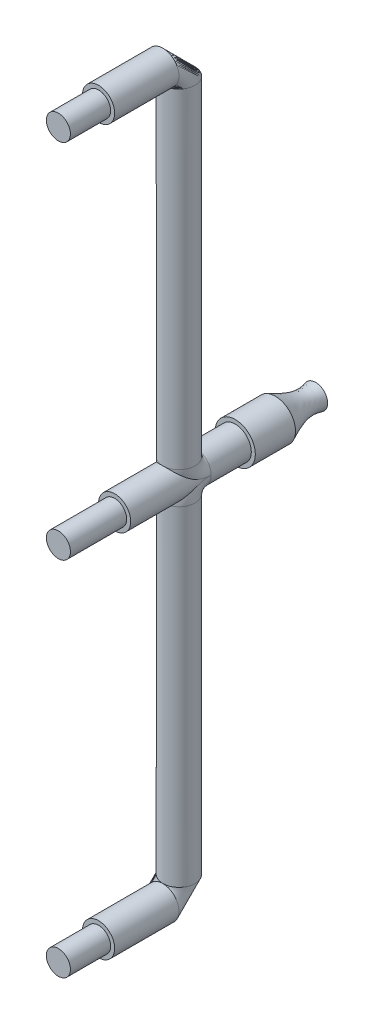
ISO-10303-21;
HEADER;
FILE_DESCRIPTION(('STEP AP214'),'2;1');
FILE_NAME('part.step','',(''),(''),'','','');
FILE_SCHEMA(('AUTOMOTIVE_DESIGN { 1 0 10303 214 1 1 1 1 }'));
ENDSEC;
DATA;
#1=APPLICATION_CONTEXT('core data for automotive mechanical design processes');
#2=APPLICATION_PROTOCOL_DEFINITION('international standard','automotive_design',2000,#1);
#3=PRODUCT_CONTEXT('',#1,'mechanical');
#4=PRODUCT('Part','Part','',(#3));
#5=PRODUCT_RELATED_PRODUCT_CATEGORY('part','',(#4));
#6=PRODUCT_DEFINITION_FORMATION('','',#4);
#7=PRODUCT_DEFINITION_CONTEXT('part definition',#1,'design');
#8=PRODUCT_DEFINITION('design','',#6,#7);
#9=PRODUCT_DEFINITION_SHAPE('','',#8);
#10=(LENGTH_UNIT() NAMED_UNIT(*) SI_UNIT(.MILLI.,.METRE.));
#11=(NAMED_UNIT(*) PLANE_ANGLE_UNIT() SI_UNIT($,.RADIAN.));
#12=(NAMED_UNIT(*) SI_UNIT($,.STERADIAN.) SOLID_ANGLE_UNIT());
#13=UNCERTAINTY_MEASURE_WITH_UNIT(LENGTH_MEASURE(1.E-05),#10,'distance_accuracy_value','');
#14=(GEOMETRIC_REPRESENTATION_CONTEXT(3) GLOBAL_UNCERTAINTY_ASSIGNED_CONTEXT((#13)) GLOBAL_UNIT_ASSIGNED_CONTEXT((#10,
#11,#12)) REPRESENTATION_CONTEXT('',''));
#15=CARTESIAN_POINT('',(0.,0.,0.));
#16=DIRECTION('',(0.,0.,1.));
#17=DIRECTION('',(1.,0.,0.));
#18=AXIS2_PLACEMENT_3D('',#15,#16,#17);
#19=CARTESIAN_POINT('',(0.,0.,4.34314575050762));
#20=DIRECTION('',(0.,0.,1.));
#21=DIRECTION('',(1.,0.,0.));
#22=AXIS2_PLACEMENT_3D('',#19,#20,#21);
#23=CYLINDRICAL_SURFACE('',#22,2.);
#24=CARTESIAN_POINT('',(0.,0.,10.));
#25=DIRECTION('',(0.,0.,1.));
#26=DIRECTION('',(1.,0.,0.));
#27=AXIS2_PLACEMENT_3D('',#24,#25,#26);
#28=CIRCLE('',#27,2.);
#29=CARTESIAN_POINT('',(2.,0.,10.));
#30=VERTEX_POINT('',#29);
#31=EDGE_CURVE('E240',#30,#30,#28,.T.);
#32=ORIENTED_EDGE('',*,*,#31,.T.);
#33=EDGE_LOOP('',(#32));
#34=FACE_BOUND('',#33,.T.);
#35=CARTESIAN_POINT('',(0.,0.,15.));
#36=DIRECTION('',(0.,0.,1.));
#37=DIRECTION('',(-1.,0.,0.));
#38=AXIS2_PLACEMENT_3D('',#35,#36,#37);
#39=CIRCLE('',#38,2.);
#40=CARTESIAN_POINT('',(2.,0.,15.));
#41=VERTEX_POINT('',#40);
#42=CARTESIAN_POINT('',(0.,-1.99999999999999,15.));
#43=VERTEX_POINT('',#42);
#44=EDGE_CURVE('E86',#41,#43,#39,.F.);
#45=ORIENTED_EDGE('',*,*,#44,.T.);
#46=CARTESIAN_POINT('',(-2.,0.,15.));
#47=VERTEX_POINT('',#46);
#48=EDGE_CURVE('E466',#43,#47,#39,.F.);
#49=ORIENTED_EDGE('',*,*,#48,.T.);
#50=CARTESIAN_POINT('',(0.,0.,15.));
#51=DIRECTION('',(0.,0.,-1.));
#52=DIRECTION('',(-1.,0.,0.));
#53=AXIS2_PLACEMENT_3D('',#50,#51,#52);
#54=CIRCLE('',#53,2.);
#55=CARTESIAN_POINT('',(0.,2.,15.));
#56=VERTEX_POINT('',#55);
#57=EDGE_CURVE('E507',#47,#56,#54,.T.);
#58=ORIENTED_EDGE('',*,*,#57,.T.);
#59=EDGE_CURVE('E252',#56,#41,#54,.T.);
#60=ORIENTED_EDGE('',*,*,#59,.T.);
#61=EDGE_LOOP('',(#45,#49,#58,#60));
#62=FACE_BOUND('',#61,.T.);
#63=ADVANCED_FACE('F67',(#34,#62),#23,.T.);
#64=CARTESIAN_POINT('',(0.,0.,25.));
#65=DIRECTION('',(0.,0.,1.));
#66=DIRECTION('',(1.,0.,0.));
#67=AXIS2_PLACEMENT_3D('',#64,#65,#66);
#68=CIRCLE('',#67,2.);
#69=CARTESIAN_POINT('',(2.,0.,25.));
#70=VERTEX_POINT('',#69);
#71=EDGE_CURVE('E196',#70,#70,#68,.T.);
#72=ORIENTED_EDGE('',*,*,#71,.F.);
#73=EDGE_LOOP('',(#72));
#74=FACE_BOUND('',#73,.T.);
#75=CARTESIAN_POINT('',(2.,0.,15.));
#76=CARTESIAN_POINT('',(1.99999972529496,2.18193282789057E-07,15.0210821847286));
#77=CARTESIAN_POINT('',(1.99999987711702,-0.000166569660332658,15.0421649907422));
#78=CARTESIAN_POINT('',(2.00000007667859,-0.00126853382162468,15.1118347884628));
#79=CARTESIAN_POINT('',(1.99999973006824,-0.00292239008952032,15.1604121043896));
#80=CARTESIAN_POINT('',(1.99998355037648,-0.00863813355059791,15.2698467138347));
#81=CARTESIAN_POINT('',(1.99996379117821,-0.013206486263921,15.3306769839563));
#82=CARTESIAN_POINT('',(1.99979700978346,-0.0310757666552085,15.5132650011202));
#83=CARTESIAN_POINT('',(1.99954179731218,-0.0485374686475325,15.6346402298685));
#84=CARTESIAN_POINT('',(1.99791768930722,-0.0940024751689228,15.8755382944537));
#85=CARTESIAN_POINT('',(1.99654717739838,-0.122021047833155,15.9950581850264));
#86=CARTESIAN_POINT('',(1.99140590482172,-0.18818908857547,16.2328026611031));
#87=CARTESIAN_POINT('',(1.98760584639158,-0.226458856111154,16.3509932643143));
#88=CARTESIAN_POINT('',(1.9759999462815,-0.311898943329805,16.5839215326804));
#89=CARTESIAN_POINT('',(1.9681917878866,-0.359074400593669,16.6986571601818));
#90=CARTESIAN_POINT('',(1.93609306759288,-0.512305597876811,17.0369203143492));
#91=CARTESIAN_POINT('',(1.90312943082028,-0.630113436333617,17.2546650278366));
#92=CARTESIAN_POINT('',(1.81648907942952,-0.841824970085179,17.5987603485447));
#93=CARTESIAN_POINT('',(1.77354445888259,-0.930394518114088,17.7311712166339));
#94=CARTESIAN_POINT('',(1.66618208512979,-1.11124242462314,17.9842632853911));
#95=CARTESIAN_POINT('',(1.60180839288057,-1.20351283405193,18.1049679033614));
#96=CARTESIAN_POINT('',(1.46759396141796,-1.36158853628121,18.3014716593264));
#97=CARTESIAN_POINT('',(1.40359436696569,-1.4279995087226,18.3807551007116));
#98=CARTESIAN_POINT('',(1.26028239147497,-1.55591749715125,18.5288521335009));
#99=CARTESIAN_POINT('',(1.18098986222956,-1.61743072621951,18.5976790936352));
#100=CARTESIAN_POINT('',(1.02533362429895,-1.7191281254167,18.7088322962234));
#101=CARTESIAN_POINT('',(0.951930169273564,-1.76106668900029,18.7536817880118));
#102=CARTESIAN_POINT('',(0.796033855385611,-1.83679681337241,18.8335321959194));
#103=CARTESIAN_POINT('',(0.713544820250279,-1.87059178250229,18.86853723327));
#104=CARTESIAN_POINT('',(0.54033611988551,-1.92780037641635,18.927248470734));
#105=CARTESIAN_POINT('',(0.449554314288935,-1.95112629040999,18.9508593285606));
#106=CARTESIAN_POINT('',(0.263231431352983,-1.98485345107013,18.9848621790362));
#107=CARTESIAN_POINT('',(0.16769457238992,-1.99526594837718,18.9952656786055));
#108=CARTESIAN_POINT('',(-0.0113124023671835,-2.00169642018067,19.0016962683037));
#109=CARTESIAN_POINT('',(-0.094664018570661,-1.99947322649888,18.9994799017028));
#110=CARTESIAN_POINT('',(-0.259525846931561,-1.98481460709376,18.9847924719952));
#111=CARTESIAN_POINT('',(-0.341036357442775,-1.97238084838486,18.9723230828342));
#112=CARTESIAN_POINT('',(-0.497357986497342,-1.9387700180865,18.9383288829359));
#113=CARTESIAN_POINT('',(-0.572300225801577,-1.917886806913,18.9171080008083));
#114=CARTESIAN_POINT('',(-0.716784940792694,-1.86870261316011,18.8665563500221));
#115=CARTESIAN_POINT('',(-0.786326253648697,-1.84040003888362,18.8372238410788));
#116=CARTESIAN_POINT('',(-0.926071496551446,-1.77453486982828,18.7679697530782));
#117=CARTESIAN_POINT('',(-0.995566624311929,-1.73630926044899,18.727256036209));
#118=CARTESIAN_POINT('',(-1.12620721462263,-1.65457201024807,18.6384822390261));
#119=CARTESIAN_POINT('',(-1.18734745911883,-1.61105709774705,18.5904176070359));
#120=CARTESIAN_POINT('',(-1.33364015284964,-1.49479627385325,18.4590130130056));
#121=CARTESIAN_POINT('',(-1.41270690523624,-1.41948580743785,18.3711431776737));
#122=CARTESIAN_POINT('',(-1.55187067550162,-1.26589684792164,18.1837117201682));
#123=CARTESIAN_POINT('',(-1.61191840879361,-1.18761122305956,18.084120624591));
#124=CARTESIAN_POINT('',(-1.73843410872019,-0.997989654337078,17.8295666835715));
#125=CARTESIAN_POINT('',(-1.79594484756117,-0.887389158684908,17.6696308152708));
#126=CARTESIAN_POINT('',(-1.88488974279862,-0.678323699500641,17.3355071313411));
#127=CARTESIAN_POINT('',(-1.91630287016347,-0.579868576797601,17.1613079464758));
#128=CARTESIAN_POINT('',(-1.95432113497206,-0.42964276399944,16.8580628855507));
#129=CARTESIAN_POINT('',(-1.96561727609676,-0.372915998954019,16.7319953400776));
#130=CARTESIAN_POINT('',(-1.98236727923143,-0.270059860363111,16.475435683757));
#131=CARTESIAN_POINT('',(-1.98782940432057,-0.223915571190338,16.3449501016159));
#132=CARTESIAN_POINT('',(-1.99586574981089,-0.136951461302321,16.0580374774612));
#133=CARTESIAN_POINT('',(-1.99780474010072,-0.0983104596538602,15.9009196350588));
#134=CARTESIAN_POINT('',(-1.99944458284647,-0.0504701446212543,15.6431110860546));
#135=CARTESIAN_POINT('',(-1.99971311889786,-0.0356635382100773,15.5434379084156));
#136=CARTESIAN_POINT('',(-1.99993332488286,-0.0176952502518891,15.3813261844864));
#137=CARTESIAN_POINT('',(-1.99996664872058,-0.0122464974084737,15.3191385956369));
#138=CARTESIAN_POINT('',(-1.99999283254501,-0.00584067017310493,15.2193862779156));
#139=CARTESIAN_POINT('',(-1.99999652239123,-0.00395896943976078,15.1818793413974));
#140=CARTESIAN_POINT('',(-1.99999958691213,-0.00162935814014564,15.1173254879913));
#141=CARTESIAN_POINT('',(-1.99999987998012,-0.000927608202707069,15.0902876368261));
#142=CARTESIAN_POINT('',(-1.99999998233864,-0.000166665969029948,15.0421653992634));
#143=CARTESIAN_POINT('',(-1.99999988404192,8.05622888119864E-08,15.0210826733891));
#144=CARTESIAN_POINT('',(-2.,0.,15.));
#145=B_SPLINE_CURVE_WITH_KNOTS('',3,(#75,#76,#77,#78,#79,#80,#81,#82,#83,#84,#85,#86,#87,#88,
#89,#90,#91,#92,#93,#94,#95,#96,#97,#98,#99,#100,#101,#102,#103,#104,#105,#106,#107,#108,#109,
#110,#111,#112,#113,#114,#115,#116,#117,#118,#119,#120,#121,#122,#123,#124,#125,#126,#127,#128,
#129,#130,#131,#132,#133,#134,#135,#136,#137,#138,#139,#140,#141,#142,#143,#144),.UNSPECIFIED.,
.F.,.F.,(4,2,2,2,2,2,2,2,2,2,2,2,2,2,2,2,2,2,2,2,2,2,2,2,2,2,2,2,2,2,2,2,2,2,4),(0.,
0.0632475295960562,0.209028701268892,0.391980311017912,0.759317393365168,1.12718779813443,
1.49958021820782,1.87218812695991,2.61690647358543,3.11051356044642,3.60311193208743,
3.96677637237323,4.32997187827563,4.61596385433442,4.90183592536598,5.19006028693574,
5.47803336009832,5.72699727828217,5.97592055777926,6.21684327297223,6.45781771636058,
6.72429560163421,6.99093916273316,7.40903227000472,7.82820009538371,8.43321226457871,
9.038711471214,9.45426195001252,9.86922307518533,10.3535370173542,10.6555808425051,
10.8427907144773,10.9554389620937,11.0365742796598,11.0998218092559),.UNSPECIFIED.);
#146=CARTESIAN_POINT('',(0.,-1.99999999999999,19.));
#147=VERTEX_POINT('',#146);
#148=EDGE_CURVE('E141',#41,#147,#145,.T.);
#149=ORIENTED_EDGE('',*,*,#148,.F.);
#150=CARTESIAN_POINT('',(-2.,0.,15.));
#151=CARTESIAN_POINT('',(-1.99999972529496,-2.18189604048532E-07,15.0210821847286));
#152=CARTESIAN_POINT('',(-1.99999987711702,0.000166569665797939,15.0421649907421));
#153=CARTESIAN_POINT('',(-2.00000007667859,0.00126853382854374,15.1118347884248));
#154=CARTESIAN_POINT('',(-1.99999973006824,0.00292239008969875,15.1604121043139));
#155=CARTESIAN_POINT('',(-1.99998355037652,0.00863813353806509,15.2698467136671));
#156=CARTESIAN_POINT('',(-1.99996379117831,0.013206486245836,15.3306769837346));
#157=CARTESIAN_POINT('',(-1.99979700978405,0.0310757666110175,15.5132650007364));
#158=CARTESIAN_POINT('',(-1.99954179731356,0.0485374685733126,15.6346402293777));
#159=CARTESIAN_POINT('',(-1.99791768931386,0.0940024750182852,15.8755382937528));
#160=CARTESIAN_POINT('',(-1.99654717740951,0.122021047636035,15.9950581842225));
#161=CARTESIAN_POINT('',(-1.99140590484984,0.188189088268105,16.2328026600953));
#162=CARTESIAN_POINT('',(-1.98760584643236,0.226458855739547,16.3509932632056));
#163=CARTESIAN_POINT('',(-1.97599994636083,0.311898942817151,16.5839215313787));
#164=CARTESIAN_POINT('',(-1.96819178799184,0.359074400004186,16.6986571587877));
#165=CARTESIAN_POINT('',(-1.93609306780392,0.512305597044087,17.0369203126951));
#166=CARTESIAN_POINT('',(-1.90312943113928,0.630113435320627,17.2546650260283));
#167=CARTESIAN_POINT('',(-1.81648907996422,0.841824968933196,17.5987603467803));
#168=CARTESIAN_POINT('',(-1.77354445946101,0.930394517016188,17.7311712150334));
#169=CARTESIAN_POINT('',(-1.66618208577432,1.11124242366065,17.9842632841077));
#170=CARTESIAN_POINT('',(-1.60180839354755,1.20351283317071,18.1049679022314));
#171=CARTESIAN_POINT('',(-1.46759396212159,1.36158853552312,18.3014716584096));
#172=CARTESIAN_POINT('',(-1.40359436769833,1.42799950800321,18.3807550998619));
#173=CARTESIAN_POINT('',(-1.26028239225638,1.555917496519,18.5288521327856));
#174=CARTESIAN_POINT('',(-1.18098986303076,1.61743072563567,18.5976790929872));
#175=CARTESIAN_POINT('',(-1.02533362512682,1.71912812492339,18.708832295692));
#176=CARTESIAN_POINT('',(-0.951930170111545,1.76106668854804,18.7536817875304));
#177=CARTESIAN_POINT('',(-0.796033856233523,1.83679681300562,18.8335321955372));
#178=CARTESIAN_POINT('',(-0.713544821098008,1.87059178217991,18.868537232937));
#179=CARTESIAN_POINT('',(-0.540336120719403,1.92780037618364,18.9272484704973));
#180=CARTESIAN_POINT('',(-0.449554315108987,1.95112629022243,18.9508593283708));
#181=CARTESIAN_POINT('',(-0.263231432132211,1.9848534509681,18.9848621789339));
#182=CARTESIAN_POINT('',(-0.167694573142188,1.99526594831557,18.9952656785439));
#183=CARTESIAN_POINT('',(0.0113124016590453,2.00169642018523,19.0016962683083));
#184=CARTESIAN_POINT('',(0.0946640178782058,1.99947322653236,18.9994799017362));
#185=CARTESIAN_POINT('',(0.259525846276641,1.98481460718007,18.9847924720817));
#186=CARTESIAN_POINT('',(0.341036356809707,1.9723808484951,18.9723230829451));
#187=CARTESIAN_POINT('',(0.497357985893645,1.9387700182414,18.9383288830931));
#188=CARTESIAN_POINT('',(0.572300225206153,1.9178868070908,18.9171080009897));
#189=CARTESIAN_POINT('',(0.716784940217805,1.86870261338075,18.8665563502502));
#190=CARTESIAN_POINT('',(0.786326253086073,1.84040003912419,18.8372238413294));
#191=CARTESIAN_POINT('',(0.926071496006941,1.77453487011215,18.7679697533793));
#192=CARTESIAN_POINT('',(0.995566623774678,1.73630926075687,18.727256036539));
#193=CARTESIAN_POINT('',(1.12620721410395,1.65457201060094,18.6384822394136));
#194=CARTESIAN_POINT('',(1.18734745861147,1.6110570981209,18.590417607452));
#195=CARTESIAN_POINT('',(1.33364015235947,1.49479627428882,18.4590130135079));
#196=CARTESIAN_POINT('',(1.41270690475754,1.41948580791316,18.371143178236));
#197=CARTESIAN_POINT('',(1.55187067505511,1.26589684846776,18.1837117208525));
#198=CARTESIAN_POINT('',(1.61191840836787,1.18761122363675,18.0841206253374));
#199=CARTESIAN_POINT('',(1.73843410834913,0.997989654981168,17.8295666844769));
#200=CARTESIAN_POINT('',(1.79594484722809,0.887389159359013,17.6696308162746));
#201=CARTESIAN_POINT('',(1.88488974254419,0.678323700207748,17.335507132545));
#202=CARTESIAN_POINT('',(1.9163028699496,0.579868577507713,17.1613079477815));
#203=CARTESIAN_POINT('',(1.95432113484095,0.429642764609951,16.8580628868708));
#204=CARTESIAN_POINT('',(1.96561727599881,0.372915999481403,16.731995341303));
#205=CARTESIAN_POINT('',(1.98236727918241,0.2700598607382,16.4754356847825));
#206=CARTESIAN_POINT('',(1.98782940428733,0.223915571496233,16.3449501025366));
#207=CARTESIAN_POINT('',(1.99586574979959,0.1369514614883,16.0580374781777));
#208=CARTESIAN_POINT('',(1.99780474009468,0.0983104597890106,15.9009196356758));
#209=CARTESIAN_POINT('',(1.99944458284489,0.0504701446923452,15.6431110865068));
#210=CARTESIAN_POINT('',(1.99971311889703,0.0356635382609819,15.5434379088046));
#211=CARTESIAN_POINT('',(1.99993332488266,0.0176952502787167,15.3813261847699));
#212=CARTESIAN_POINT('',(1.99996664872048,0.0122464974281399,15.3191385958786));
#213=CARTESIAN_POINT('',(1.99999283254499,0.00584067018235873,15.2193862780887));
#214=CARTESIAN_POINT('',(1.99999652239122,0.00395896944534562,15.1818793415437));
#215=CARTESIAN_POINT('',(1.99999958691213,0.00162935814544802,15.1173254880709));
#216=CARTESIAN_POINT('',(1.99999987998012,0.00092760820991657,15.0902876368658));
#217=CARTESIAN_POINT('',(1.99999998233864,0.000166665976205468,15.0421653992633));
#218=CARTESIAN_POINT('',(1.99999988404192,-8.05566805519566E-08,15.0210826733891));
#219=CARTESIAN_POINT('',(2.,0.,15.));
#220=B_SPLINE_CURVE_WITH_KNOTS('',3,(#150,#151,#152,#153,#154,#155,#156,#157,#158,#159,#160,
#161,#162,#163,#164,#165,#166,#167,#168,#169,#170,#171,#172,#173,#174,#175,#176,#177,#178,#179,
#180,#181,#182,#183,#184,#185,#186,#187,#188,#189,#190,#191,#192,#193,#194,#195,#196,#197,#198,
#199,#200,#201,#202,#203,#204,#205,#206,#207,#208,#209,#210,#211,#212,#213,#214,#215,#216,#217,
#218,#219),.UNSPECIFIED.,.F.,.F.,(4,2,2,2,2,2,2,2,2,2,2,2,2,2,2,2,2,2,2,2,2,2,2,2,2,2,2,2,2,2,2,
2,2,2,4),(0.,0.0632475295961043,0.2090287011551,0.391980310741116,0.759317392759424,
1.12718779719681,1.49958021692357,1.87218812532813,2.61690647126975,3.11051355857599,
3.60311193066031,3.96677637109501,4.32997187714599,4.61596385330558,4.90183592443811,
5.19006028611286,5.47803335937964,5.72699727760523,5.97592055714384,6.21684327232286,
6.4578177156971,6.72429560091715,6.99093916196248,7.40903226907764,7.82820009429925,
8.43321226324596,9.03871146963473,9.45426194880011,9.869223074339,10.3535370168326,
10.6555808421793,10.8427907142783,10.9554389619753,11.0365742796608,11.0998218092569),.UNSPECIFIED.);
#221=CARTESIAN_POINT('',(0.,2.,19.));
#222=VERTEX_POINT('',#221);
#223=EDGE_CURVE('E195',#41,#222,#220,.F.);
#224=ORIENTED_EDGE('',*,*,#223,.T.);
#225=EDGE_CURVE('E187',#222,#47,#220,.F.);
#226=ORIENTED_EDGE('',*,*,#225,.T.);
#227=EDGE_CURVE('E94',#147,#47,#145,.T.);
#228=ORIENTED_EDGE('',*,*,#227,.F.);
#229=EDGE_LOOP('',(#149,#224,#226,#228));
#230=FACE_BOUND('',#229,.T.);
#231=ADVANCED_FACE('F177',(#74,#230),#23,.T.);
#232=CARTESIAN_POINT('',(0.,0.,32.5));
#233=DIRECTION('',(0.,0.,-1.));
#234=DIRECTION('',(-1.,0.,0.));
#235=AXIS2_PLACEMENT_3D('',#232,#233,#234);
#236=CYLINDRICAL_SURFACE('',#235,1.5);
#237=CARTESIAN_POINT('',(0.,0.,25.));
#238=DIRECTION('',(0.,0.,1.));
#239=DIRECTION('',(1.,0.,0.));
#240=AXIS2_PLACEMENT_3D('',#237,#238,#239);
#241=CIRCLE('',#240,1.5);
#242=CARTESIAN_POINT('',(1.5,0.,25.));
#243=VERTEX_POINT('',#242);
#244=EDGE_CURVE('E12',#243,#243,#241,.T.);
#245=ORIENTED_EDGE('',*,*,#244,.T.);
#246=EDGE_LOOP('',(#245));
#247=FACE_BOUND('',#246,.T.);
#248=CARTESIAN_POINT('',(0.,0.,32.));
#249=DIRECTION('',(0.,0.,1.));
#250=DIRECTION('',(1.,0.,0.));
#251=AXIS2_PLACEMENT_3D('',#248,#249,#250);
#252=CIRCLE('',#251,1.5);
#253=CARTESIAN_POINT('',(1.5,0.,32.));
#254=VERTEX_POINT('',#253);
#255=EDGE_CURVE('E72',#254,#254,#252,.T.);
#256=ORIENTED_EDGE('',*,*,#255,.F.);
#257=EDGE_LOOP('',(#256));
#258=FACE_BOUND('',#257,.T.);
#259=ADVANCED_FACE('F173',(#247,#258),#236,.T.);
#260=CARTESIAN_POINT('',(0.,2.,17.));
#261=DIRECTION('',(0.,-1.,0.));
#262=DIRECTION('',(0.,0.,1.));
#263=AXIS2_PLACEMENT_3D('',#260,#261,#262);
#264=CIRCLE('',#263,2.);
#265=TRIMMED_CURVE('',#264,(PARAMETER_VALUE(-3.14159256798914)),
(PARAMETER_VALUE(3.14159256798914)),.T.,.PARAMETER.);
#266=CARTESIAN_POINT('',(0.,2.,15.));
#267=DIRECTION('',(-1.,0.,0.));
#268=AXIS1_PLACEMENT('',#266,#267);
#269=SURFACE_OF_REVOLUTION('',#265,#268);
#270=ORIENTED_EDGE('',*,*,#223,.F.);
#271=ORIENTED_EDGE('',*,*,#59,.F.);
#272=CARTESIAN_POINT('',(0.,2.,17.));
#273=DIRECTION('',(0.,-1.,0.));
#274=DIRECTION('',(-1.,0.,0.));
#275=AXIS2_PLACEMENT_3D('',#272,#273,#274);
#276=CIRCLE('',#275,2.);
#277=EDGE_CURVE('E492',#56,#222,#276,.T.);
#278=ORIENTED_EDGE('',*,*,#277,.T.);
#279=EDGE_LOOP('',(#270,#271,#278));
#280=FACE_BOUND('',#279,.T.);
#281=ADVANCED_FACE('F176',(#280),#269,.T.);
#282=ORIENTED_EDGE('',*,*,#225,.F.);
#283=EDGE_CURVE('E489',#222,#56,#276,.T.);
#284=ORIENTED_EDGE('',*,*,#283,.T.);
#285=ORIENTED_EDGE('',*,*,#57,.F.);
#286=EDGE_LOOP('',(#282,#284,#285));
#287=FACE_BOUND('',#286,.T.);
#288=ADVANCED_FACE('F202',(#287),#269,.T.);
#289=CARTESIAN_POINT('',(0.,0.,0.));
#290=DIRECTION('',(0.,0.,1.));
#291=DIRECTION('',(1.,0.,0.));
#292=AXIS2_PLACEMENT_3D('',#289,#290,#291);
#293=PLANE('',#292);
#294=CARTESIAN_POINT('',(0.,0.,0.));
#295=DIRECTION('',(0.,0.,1.));
#296=DIRECTION('',(1.,0.,0.));
#297=AXIS2_PLACEMENT_3D('',#294,#295,#296);
#298=CIRCLE('',#297,1.5);
#299=CARTESIAN_POINT('',(-1.46051170327089,0.34191455746831,0.));
#300=VERTEX_POINT('',#299);
#301=EDGE_CURVE('E242',#300,#300,#298,.T.);
#302=ORIENTED_EDGE('',*,*,#301,.F.);
#303=EDGE_LOOP('',(#302));
#304=FACE_BOUND('',#303,.T.);
#305=ADVANCED_FACE('F69',(#304),#293,.F.);
#306=CARTESIAN_POINT('',(0.398841505996215,2.46798003498705,5.));
#307=CARTESIAN_POINT('',(-1.46051170327089,0.34191455746831,0.));
#308=CARTESIAN_POINT('',(5.33480157597031,1.67029702299462,5.));
#309=CARTESIAN_POINT('',(-0.776682588334274,3.2629379640101,0.));
#310=CARTESIAN_POINT('',(4.53711856397788,-3.26566304697948,5.));
#311=CARTESIAN_POINT('',(2.14434081820752,2.57910884907348,0.));
#312=CARTESIAN_POINT('',(-0.398841505996216,-2.46798003498705,5.));
#313=CARTESIAN_POINT('',(1.46051170327089,-0.341914557468311,0.));
#314=CARTESIAN_POINT('',(-5.33480157597031,-1.67029702299462,5.));
#315=CARTESIAN_POINT('',(0.776682588334273,-3.2629379640101,0.));
#316=CARTESIAN_POINT('',(-4.53711856397788,3.26566304697948,5.));
#317=CARTESIAN_POINT('',(-2.14434081820752,-2.57910884907348,0.));
#318=CARTESIAN_POINT('',(0.398841505996215,2.46798003498705,5.));
#319=CARTESIAN_POINT('',(-1.46051170327089,0.34191455746831,0.));
#320=(BOUNDED_SURFACE() B_SPLINE_SURFACE(3,1,((#306,#307),(#308,#309),(#310,#311),(#312,#313),
(#314,#315),(#316,#317),(#318,#319)),.UNSPECIFIED.,.T.,.F.,.F.) B_SPLINE_SURFACE_WITH_KNOTS((4,
3,4),(2,2),(0.,0.5,1.),(0.,1.),
.UNSPECIFIED.) GEOMETRIC_REPRESENTATION_ITEM() RATIONAL_B_SPLINE_SURFACE(((1.,1.),
(0.333333333333333,0.333333333333333),(0.333333333333333,0.333333333333333),(1.,1.),
(0.333333333333333,0.333333333333333),(0.333333333333333,0.333333333333333),(1.,1.))) REPRESENTATION_ITEM('') SURFACE());
#321=CARTESIAN_POINT('',(0.,0.,5.));
#322=DIRECTION('',(0.,0.,1.));
#323=DIRECTION('',(1.,0.,0.));
#324=AXIS2_PLACEMENT_3D('',#321,#322,#323);
#325=CIRCLE('',#324,2.5);
#326=CARTESIAN_POINT('',(0.398841505996215,2.46798003498705,5.));
#327=VERTEX_POINT('',#326);
#328=EDGE_CURVE('E248',#327,#327,#325,.T.);
#329=CARTESIAN_POINT('',(0.398841505996215,2.46798003498705,5.));
#330=CARTESIAN_POINT('',(0.379473243399683,2.44583351959623,4.94791666666667));
#331=CARTESIAN_POINT('',(0.360104980803151,2.42368700420541,4.89583333333333));
#332=CARTESIAN_POINT('',(0.321368455610086,2.37939397342377,4.79166666666667));
#333=CARTESIAN_POINT('',(0.302000193013553,2.35724745803295,4.73958333333333));
#334=CARTESIAN_POINT('',(0.263263667820489,2.31295442725131,4.63541666666667));
#335=CARTESIAN_POINT('',(0.243895405223956,2.29080791186049,4.58333333333333));
#336=CARTESIAN_POINT('',(0.205158880030891,2.24651488107885,4.47916666666667));
#337=CARTESIAN_POINT('',(0.185790617434359,2.22436836568803,4.42708333333333));
#338=CARTESIAN_POINT('',(0.147054092241294,2.18007533490639,4.32291666666667));
#339=CARTESIAN_POINT('',(0.127685829644762,2.15792881951557,4.27083333333333));
#340=CARTESIAN_POINT('',(0.088949304451697,2.11363578873392,4.16666666666667));
#341=CARTESIAN_POINT('',(0.0695810418551646,2.09148927334311,4.11458333333333));
#342=CARTESIAN_POINT('',(0.0308445166620998,2.04719624256147,4.01041666666667));
#343=CARTESIAN_POINT('',(0.0114762540655674,2.02504972717064,3.95833333333333));
#344=CARTESIAN_POINT('',(-0.0272602711274974,1.980756696389,3.85416666666667));
#345=CARTESIAN_POINT('',(-0.0466285337240298,1.95861018099818,3.80208333333333));
#346=CARTESIAN_POINT('',(-0.0853650589170946,1.91431715021654,3.69791666666667));
#347=CARTESIAN_POINT('',(-0.104733321513627,1.89217063482572,3.64583333333333));
#348=CARTESIAN_POINT('',(-0.143469846706692,1.84787760404408,3.54166666666667));
#349=CARTESIAN_POINT('',(-0.162838109303224,1.82573108865326,3.48958333333333));
#350=CARTESIAN_POINT('',(-0.201574634496289,1.78143805787162,3.38541666666667));
#351=CARTESIAN_POINT('',(-0.220942897092821,1.7592915424808,3.33333333333333));
#352=CARTESIAN_POINT('',(-0.259679422285886,1.71499851169916,3.22916666666667));
#353=CARTESIAN_POINT('',(-0.279047684882419,1.69285199630834,3.17708333333333));
#354=CARTESIAN_POINT('',(-0.317784210075483,1.6485589655267,3.07291666666667));
#355=CARTESIAN_POINT('',(-0.337152472672016,1.62641245013588,3.02083333333333));
#356=CARTESIAN_POINT('',(-0.375888997865081,1.58211941935424,2.91666666666667));
#357=CARTESIAN_POINT('',(-0.395257260461613,1.55997290396342,2.86458333333333));
#358=CARTESIAN_POINT('',(-0.433993785654678,1.51567987318178,2.76041666666667));
#359=CARTESIAN_POINT('',(-0.45336204825121,1.49353335779096,2.70833333333333));
#360=CARTESIAN_POINT('',(-0.492098573444275,1.44924032700932,2.60416666666667));
#361=CARTESIAN_POINT('',(-0.511466836040807,1.4270938116185,2.55208333333333));
#362=CARTESIAN_POINT('',(-0.550203361233872,1.38280078083686,2.44791666666667));
#363=CARTESIAN_POINT('',(-0.569571623830404,1.36065426544604,2.39583333333333));
#364=CARTESIAN_POINT('',(-0.608308149023469,1.3163612346644,2.29166666666667));
#365=CARTESIAN_POINT('',(-0.627676411620002,1.29421471927358,2.23958333333333));
#366=CARTESIAN_POINT('',(-0.666412936813066,1.24992168849194,2.13541666666667));
#367=CARTESIAN_POINT('',(-0.685781199409599,1.22777517310112,2.08333333333333));
#368=CARTESIAN_POINT('',(-0.724517724602664,1.18348214231948,1.97916666666667));
#369=CARTESIAN_POINT('',(-0.743885987199196,1.16133562692866,1.92708333333333));
#370=CARTESIAN_POINT('',(-0.782622512392261,1.11704259614702,1.82291666666667));
#371=CARTESIAN_POINT('',(-0.801990774988793,1.0948960807562,1.77083333333333));
#372=CARTESIAN_POINT('',(-0.840727300181858,1.05060304997456,1.66666666666667));
#373=CARTESIAN_POINT('',(-0.860095562778391,1.02845653458374,1.61458333333333));
#374=CARTESIAN_POINT('',(-0.898832087971455,0.984163503802096,1.51041666666667));
#375=CARTESIAN_POINT('',(-0.918200350567988,0.962016988411276,1.45833333333333));
#376=CARTESIAN_POINT('',(-0.956936875761052,0.917723957629635,1.35416666666667));
#377=CARTESIAN_POINT('',(-0.976305138357585,0.895577442238815,1.30208333333333));
#378=CARTESIAN_POINT('',(-1.01504166355065,0.851284411457175,1.19791666666667));
#379=CARTESIAN_POINT('',(-1.03440992614718,0.829137896066354,1.14583333333333));
#380=CARTESIAN_POINT('',(-1.07314645134025,0.784844865284714,1.04166666666667));
#381=CARTESIAN_POINT('',(-1.09251471393678,0.762698349893894,0.989583333333333));
#382=CARTESIAN_POINT('',(-1.13125123912984,0.718405319112253,0.885416666666667));
#383=CARTESIAN_POINT('',(-1.15061950172638,0.696258803721433,0.833333333333333));
#384=CARTESIAN_POINT('',(-1.18935602691944,0.651965772939793,0.729166666666667));
#385=CARTESIAN_POINT('',(-1.20872428951597,0.629819257548973,0.677083333333333));
#386=CARTESIAN_POINT('',(-1.24746081470904,0.585526226767332,0.572916666666667));
#387=CARTESIAN_POINT('',(-1.26682907730557,0.563379711376512,0.520833333333333));
#388=CARTESIAN_POINT('',(-1.30556560249864,0.519086680594872,0.416666666666667));
#389=CARTESIAN_POINT('',(-1.32493386509517,0.496940165204052,0.364583333333333));
#390=CARTESIAN_POINT('',(-1.36367039028823,0.452647134422411,0.260416666666667));
#391=CARTESIAN_POINT('',(-1.38303865288477,0.430500619031591,0.208333333333333));
#392=CARTESIAN_POINT('',(-1.42177517807783,0.386207588249951,0.104166666666667));
#393=CARTESIAN_POINT('',(-1.44114344067436,0.364061072859131,0.0520833333333333));
#394=CARTESIAN_POINT('',(-1.46051170327089,0.34191455746831,0.));
#395=B_SPLINE_CURVE_WITH_KNOTS('',3,(#329,#330,#331,#332,#333,#334,#335,#336,#337,#338,#339,
#340,#341,#342,#343,#344,#345,#346,#347,#348,#349,#350,#351,#352,#353,#354,#355,#356,#357,#358,
#359,#360,#361,#362,#363,#364,#365,#366,#367,#368,#369,#370,#371,#372,#373,#374,#375,#376,#377,
#378,#379,#380,#381,#382,#383,#384,#385,#386,#387,#388,#389,#390,#391,#392,#393,#394),
.UNSPECIFIED.,.F.,.F.,(4,2,2,2,2,2,2,2,2,2,2,2,2,2,2,2,2,2,2,2,2,2,2,2,2,2,2,2,2,2,2,2,4),(0.,
0.179455961616428,0.358911923232855,0.538367884849282,0.717823846465709,0.897279808082137,
1.07673576969856,1.25619173131499,1.43564769293142,1.61510365454785,1.79455961616427,
1.9740155777807,2.15347153939713,2.33292750101356,2.51238346262998,2.69183942424641,
2.87129538586284,3.05075134747926,3.23020730909569,3.40966327071212,3.58911923232855,
3.76857519394497,3.9480311555614,4.12748711717783,4.30694307879426,4.48639904041068,
4.66585500202711,4.84531096364354,5.02476692525996,5.20422288687639,5.38367884849282,
5.56313481010925,5.74259077172567),.UNSPECIFIED.);
#396=EDGE_CURVE('BSEAM266',#327,#300,#395,.T.);
#397=ORIENTED_EDGE('',*,*,#328,.F.);
#398=ORIENTED_EDGE('',*,*,#301,.T.);
#399=ORIENTED_EDGE('',*,*,#396,.T.);
#400=ORIENTED_EDGE('',*,*,#396,.F.);
#401=EDGE_LOOP('',(#397,#399,#398,#400));
#402=FACE_BOUND('',#401,.T.);
#403=ADVANCED_FACE('F266',(#402),#320,.T.);
#404=CARTESIAN_POINT('',(0.,0.,10.));
#405=DIRECTION('',(0.,0.,-1.));
#406=DIRECTION('',(-1.,0.,0.));
#407=AXIS2_PLACEMENT_3D('',#404,#405,#406);
#408=CYLINDRICAL_SURFACE('',#407,2.5);
#409=CARTESIAN_POINT('',(0.,0.,10.));
#410=DIRECTION('',(0.,0.,1.));
#411=DIRECTION('',(1.,0.,0.));
#412=AXIS2_PLACEMENT_3D('',#409,#410,#411);
#413=CIRCLE('',#412,2.5);
#414=CARTESIAN_POINT('',(2.5,0.,10.));
#415=VERTEX_POINT('',#414);
#416=EDGE_CURVE('E254',#415,#415,#413,.T.);
#417=ORIENTED_EDGE('',*,*,#416,.F.);
#418=EDGE_LOOP('',(#417));
#419=FACE_BOUND('',#418,.T.);
#420=ORIENTED_EDGE('',*,*,#328,.T.);
#421=EDGE_LOOP('',(#420));
#422=FACE_BOUND('',#421,.T.);
#423=ADVANCED_FACE('F225',(#419,#422),#408,.T.);
#424=CARTESIAN_POINT('',(0.,0.,10.));
#425=DIRECTION('',(0.,0.,1.));
#426=DIRECTION('',(1.,0.,0.));
#427=AXIS2_PLACEMENT_3D('',#424,#425,#426);
#428=PLANE('',#427);
#429=ORIENTED_EDGE('',*,*,#31,.F.);
#430=EDGE_LOOP('',(#429));
#431=FACE_BOUND('',#430,.T.);
#432=ORIENTED_EDGE('',*,*,#416,.T.);
#433=EDGE_LOOP('',(#432));
#434=FACE_BOUND('',#433,.T.);
#435=ADVANCED_FACE('F217',(#431,#434),#428,.T.);
#436=CARTESIAN_POINT('',(0.,45.,27.));
#437=DIRECTION('',(0.,0.,-1.));
#438=DIRECTION('',(-1.,0.,0.));
#439=AXIS2_PLACEMENT_3D('',#436,#437,#438);
#440=PLANE('',#439);
#441=CARTESIAN_POINT('',(0.,45.,27.));
#442=DIRECTION('',(0.,0.,1.));
#443=DIRECTION('',(1.,0.,0.));
#444=AXIS2_PLACEMENT_3D('',#441,#442,#443);
#445=CIRCLE('',#444,1.5);
#446=CARTESIAN_POINT('',(1.5,45.,27.));
#447=VERTEX_POINT('',#446);
#448=EDGE_CURVE('E78',#447,#447,#445,.T.);
#449=ORIENTED_EDGE('',*,*,#448,.F.);
#450=EDGE_LOOP('',(#449));
#451=FACE_BOUND('',#450,.T.);
#452=CARTESIAN_POINT('',(0.,45.,27.));
#453=DIRECTION('',(0.,0.,-1.));
#454=DIRECTION('',(-1.,0.,0.));
#455=AXIS2_PLACEMENT_3D('',#452,#453,#454);
#456=CIRCLE('',#455,2.);
#457=CARTESIAN_POINT('',(-2.,45.,27.));
#458=VERTEX_POINT('',#457);
#459=EDGE_CURVE('E503',#458,#458,#456,.T.);
#460=ORIENTED_EDGE('',*,*,#459,.F.);
#461=EDGE_LOOP('',(#460));
#462=FACE_BOUND('',#461,.T.);
#463=ADVANCED_FACE('F209',(#451,#462),#440,.F.);
#464=CARTESIAN_POINT('',(0.,2.,17.));
#465=DIRECTION('',(0.,1.,0.));
#466=DIRECTION('',(0.,0.,1.));
#467=AXIS2_PLACEMENT_3D('',#464,#465,#466);
#468=CYLINDRICAL_SURFACE('',#467,2.);
#469=CARTESIAN_POINT('',(0.,43.,17.));
#470=DIRECTION('',(0.,-1.,0.));
#471=DIRECTION('',(-1.,0.,0.));
#472=AXIS2_PLACEMENT_3D('',#469,#470,#471);
#473=CIRCLE('',#472,2.);
#474=CARTESIAN_POINT('',(0.,43.,19.));
#475=VERTEX_POINT('',#474);
#476=EDGE_CURVE('E496',#475,#475,#473,.T.);
#477=ORIENTED_EDGE('',*,*,#476,.T.);
#478=EDGE_LOOP('',(#477));
#479=FACE_BOUND('',#478,.T.);
#480=ORIENTED_EDGE('',*,*,#277,.F.);
#481=ORIENTED_EDGE('',*,*,#283,.F.);
#482=EDGE_LOOP('',(#480,#481));
#483=FACE_BOUND('',#482,.T.);
#484=ADVANCED_FACE('F205',(#479,#483),#468,.T.);
#485=CARTESIAN_POINT('',(0.,43.,19.));
#486=DIRECTION('',(1.,0.,0.));
#487=DIRECTION('',(0.,0.,-1.));
#488=AXIS2_PLACEMENT_3D('',#485,#486,#487);
#489=TOROIDAL_SURFACE('',#488,2.00000000000001,2.);
#490=CARTESIAN_POINT('',(0.,45.0000000000002,18.9999999999996));
#491=DIRECTION('',(0.,0.,-1.));
#492=DIRECTION('',(-1.,0.,0.));
#493=AXIS2_PLACEMENT_3D('',#490,#491,#492);
#494=CIRCLE('',#493,2.);
#495=EDGE_CURVE('E499',#475,#475,#494,.T.);
#496=ORIENTED_EDGE('',*,*,#495,.T.);
#497=ORIENTED_EDGE('',*,*,#476,.F.);
#498=EDGE_LOOP('',(#496,#497));
#499=FACE_BOUND('',#498,.T.);
#500=ADVANCED_FACE('F208',(#499),#489,.T.);
#501=CARTESIAN_POINT('',(0.,45.,19.));
#502=DIRECTION('',(0.,0.,1.));
#503=DIRECTION('',(1.,0.,0.));
#504=AXIS2_PLACEMENT_3D('',#501,#502,#503);
#505=CYLINDRICAL_SURFACE('',#504,2.);
#506=ORIENTED_EDGE('',*,*,#459,.T.);
#507=EDGE_LOOP('',(#506));
#508=FACE_BOUND('',#507,.T.);
#509=ORIENTED_EDGE('',*,*,#495,.F.);
#510=EDGE_LOOP('',(#509));
#511=FACE_BOUND('',#510,.T.);
#512=ADVANCED_FACE('F213',(#508,#511),#505,.T.);
#513=CARTESIAN_POINT('',(0.,45.,32.));
#514=DIRECTION('',(0.,0.,-1.));
#515=DIRECTION('',(-1.,0.,0.));
#516=AXIS2_PLACEMENT_3D('',#513,#514,#515);
#517=CYLINDRICAL_SURFACE('',#516,1.5);
#518=CARTESIAN_POINT('',(0.,45.,32.));
#519=DIRECTION('',(0.,0.,1.));
#520=DIRECTION('',(1.,0.,0.));
#521=AXIS2_PLACEMENT_3D('',#518,#519,#520);
#522=CIRCLE('',#521,1.5);
#523=CARTESIAN_POINT('',(1.5,45.,32.));
#524=VERTEX_POINT('',#523);
#525=EDGE_CURVE('E197',#524,#524,#522,.T.);
#526=ORIENTED_EDGE('',*,*,#525,.F.);
#527=EDGE_LOOP('',(#526));
#528=FACE_BOUND('',#527,.T.);
#529=ORIENTED_EDGE('',*,*,#448,.T.);
#530=EDGE_LOOP('',(#529));
#531=FACE_BOUND('',#530,.T.);
#532=ADVANCED_FACE('F204',(#528,#531),#517,.T.);
#533=CARTESIAN_POINT('',(0.,45.,32.));
#534=DIRECTION('',(0.,0.,1.));
#535=DIRECTION('',(1.,0.,0.));
#536=AXIS2_PLACEMENT_3D('',#533,#534,#535);
#537=PLANE('',#536);
#538=ORIENTED_EDGE('',*,*,#525,.T.);
#539=EDGE_LOOP('',(#538));
#540=FACE_BOUND('',#539,.T.);
#541=ADVANCED_FACE('F181',(#540),#537,.T.);
#542=CARTESIAN_POINT('',(0.,0.,25.));
#543=DIRECTION('',(0.,0.,1.));
#544=DIRECTION('',(1.,0.,0.));
#545=AXIS2_PLACEMENT_3D('',#542,#543,#544);
#546=PLANE('',#545);
#547=ORIENTED_EDGE('',*,*,#244,.F.);
#548=EDGE_LOOP('',(#547));
#549=FACE_BOUND('',#548,.T.);
#550=ORIENTED_EDGE('',*,*,#71,.T.);
#551=EDGE_LOOP('',(#550));
#552=FACE_BOUND('',#551,.T.);
#553=ADVANCED_FACE('F171',(#549,#552),#546,.T.);
#554=CARTESIAN_POINT('',(0.,45.,32.));
#555=DIRECTION('',(0.,0.,1.));
#556=DIRECTION('',(1.,0.,0.));
#557=AXIS2_PLACEMENT_3D('',#554,#555,#556);
#558=PLANE('',#557);
#559=ORIENTED_EDGE('',*,*,#255,.T.);
#560=EDGE_LOOP('',(#559));
#561=FACE_BOUND('',#560,.T.);
#562=ADVANCED_FACE('F152',(#561),#558,.T.);
#563=CARTESIAN_POINT('',(0.,-2.,13.));
#564=DIRECTION('',(0.,-1.,0.));
#565=DIRECTION('',(0.,0.,-1.));
#566=AXIS2_PLACEMENT_3D('',#563,#564,#565);
#567=CIRCLE('',#566,2.);
#568=TRIMMED_CURVE('',#567,(PARAMETER_VALUE(-3.14159256798914)),
(PARAMETER_VALUE(3.14159256798914)),.T.,.PARAMETER.);
#569=CARTESIAN_POINT('',(0.,-2.,15.));
#570=DIRECTION('',(1.,0.,0.));
#571=AXIS1_PLACEMENT('',#569,#570);
#572=SURFACE_OF_REVOLUTION('',#568,#571);
#573=ORIENTED_EDGE('',*,*,#44,.F.);
#574=ORIENTED_EDGE('',*,*,#148,.T.);
#575=CARTESIAN_POINT('',(0.,-2.,17.));
#576=DIRECTION('',(0.,-1.,0.));
#577=DIRECTION('',(-1.,0.,0.));
#578=AXIS2_PLACEMENT_3D('',#575,#576,#577);
#579=CIRCLE('',#578,2.);
#580=EDGE_CURVE('E127',#147,#43,#579,.F.);
#581=ORIENTED_EDGE('',*,*,#580,.T.);
#582=EDGE_LOOP('',(#573,#574,#581));
#583=FACE_BOUND('',#582,.T.);
#584=ADVANCED_FACE('F146',(#583),#572,.T.);
#585=EDGE_CURVE('E120',#43,#147,#579,.F.);
#586=ORIENTED_EDGE('',*,*,#585,.T.);
#587=ORIENTED_EDGE('',*,*,#227,.T.);
#588=ORIENTED_EDGE('',*,*,#48,.F.);
#589=EDGE_LOOP('',(#586,#587,#588));
#590=FACE_BOUND('',#589,.T.);
#591=ADVANCED_FACE('F151',(#590),#572,.T.);
#592=CARTESIAN_POINT('',(0.,-45.,27.));
#593=DIRECTION('',(0.,0.,-1.));
#594=DIRECTION('',(-1.,0.,0.));
#595=AXIS2_PLACEMENT_3D('',#592,#593,#594);
#596=PLANE('',#595);
#597=CARTESIAN_POINT('',(0.,-45.,27.));
#598=DIRECTION('',(0.,0.,-1.));
#599=DIRECTION('',(1.,0.,0.));
#600=AXIS2_PLACEMENT_3D('',#597,#598,#599);
#601=CIRCLE('',#600,1.5);
#602=CARTESIAN_POINT('',(1.5,-45.,27.));
#603=VERTEX_POINT('',#602);
#604=EDGE_CURVE('E462',#603,#603,#601,.T.);
#605=ORIENTED_EDGE('',*,*,#604,.T.);
#606=EDGE_LOOP('',(#605));
#607=FACE_BOUND('',#606,.T.);
#608=CARTESIAN_POINT('',(0.,-45.,27.));
#609=DIRECTION('',(0.,0.,1.));
#610=DIRECTION('',(-1.,0.,0.));
#611=AXIS2_PLACEMENT_3D('',#608,#609,#610);
#612=CIRCLE('',#611,2.);
#613=CARTESIAN_POINT('',(-2.,-45.,27.));
#614=VERTEX_POINT('',#613);
#615=EDGE_CURVE('E124',#614,#614,#612,.F.);
#616=ORIENTED_EDGE('',*,*,#615,.F.);
#617=EDGE_LOOP('',(#616));
#618=FACE_BOUND('',#617,.T.);
#619=ADVANCED_FACE('F159',(#607,#618),#596,.F.);
#620=CARTESIAN_POINT('',(0.,-2.,17.));
#621=DIRECTION('',(0.,-1.,0.));
#622=DIRECTION('',(0.,0.,-1.));
#623=AXIS2_PLACEMENT_3D('',#620,#621,#622);
#624=CYLINDRICAL_SURFACE('',#623,2.);
#625=CARTESIAN_POINT('',(0.,-43.,17.));
#626=DIRECTION('',(0.,-1.,0.));
#627=DIRECTION('',(-1.,0.,0.));
#628=AXIS2_PLACEMENT_3D('',#625,#626,#627);
#629=CIRCLE('',#628,2.);
#630=CARTESIAN_POINT('',(0.,-43.,19.));
#631=VERTEX_POINT('',#630);
#632=EDGE_CURVE('E114',#631,#631,#629,.F.);
#633=ORIENTED_EDGE('',*,*,#632,.T.);
#634=EDGE_LOOP('',(#633));
#635=FACE_BOUND('',#634,.T.);
#636=ORIENTED_EDGE('',*,*,#585,.F.);
#637=ORIENTED_EDGE('',*,*,#580,.F.);
#638=EDGE_LOOP('',(#636,#637));
#639=FACE_BOUND('',#638,.T.);
#640=ADVANCED_FACE('F156',(#635,#639),#624,.T.);
#641=CARTESIAN_POINT('',(0.,-43.,19.));
#642=DIRECTION('',(-1.,0.,0.));
#643=DIRECTION('',(0.,0.,1.));
#644=AXIS2_PLACEMENT_3D('',#641,#642,#643);
#645=TOROIDAL_SURFACE('',#644,2.00000000000001,2.);
#646=CARTESIAN_POINT('',(0.,-45.0000000000002,18.9999999999996));
#647=DIRECTION('',(0.,0.,1.));
#648=DIRECTION('',(-1.,0.,0.));
#649=AXIS2_PLACEMENT_3D('',#646,#647,#648);
#650=CIRCLE('',#649,2.);
#651=EDGE_CURVE('E117',#631,#631,#650,.F.);
#652=ORIENTED_EDGE('',*,*,#651,.T.);
#653=ORIENTED_EDGE('',*,*,#632,.F.);
#654=EDGE_LOOP('',(#652,#653));
#655=FACE_BOUND('',#654,.T.);
#656=ADVANCED_FACE('F115',(#655),#645,.T.);
#657=CARTESIAN_POINT('',(0.,-45.,19.));
#658=DIRECTION('',(0.,0.,1.));
#659=DIRECTION('',(1.,0.,0.));
#660=AXIS2_PLACEMENT_3D('',#657,#658,#659);
#661=CYLINDRICAL_SURFACE('',#660,2.);
#662=ORIENTED_EDGE('',*,*,#615,.T.);
#663=EDGE_LOOP('',(#662));
#664=FACE_BOUND('',#663,.T.);
#665=ORIENTED_EDGE('',*,*,#651,.F.);
#666=EDGE_LOOP('',(#665));
#667=FACE_BOUND('',#666,.T.);
#668=ADVANCED_FACE('F162',(#664,#667),#661,.T.);
#669=CARTESIAN_POINT('',(0.,-45.,32.));
#670=DIRECTION('',(0.,0.,-1.));
#671=DIRECTION('',(-1.,0.,0.));
#672=AXIS2_PLACEMENT_3D('',#669,#670,#671);
#673=CYLINDRICAL_SURFACE('',#672,1.5);
#674=CARTESIAN_POINT('',(0.,-45.,32.));
#675=DIRECTION('',(0.,0.,-1.));
#676=DIRECTION('',(1.,0.,0.));
#677=AXIS2_PLACEMENT_3D('',#674,#675,#676);
#678=CIRCLE('',#677,1.5);
#679=CARTESIAN_POINT('',(1.5,-45.,32.));
#680=VERTEX_POINT('',#679);
#681=EDGE_CURVE('E460',#680,#680,#678,.T.);
#682=ORIENTED_EDGE('',*,*,#681,.T.);
#683=EDGE_LOOP('',(#682));
#684=FACE_BOUND('',#683,.T.);
#685=ORIENTED_EDGE('',*,*,#604,.F.);
#686=EDGE_LOOP('',(#685));
#687=FACE_BOUND('',#686,.T.);
#688=ADVANCED_FACE('F154',(#684,#687),#673,.T.);
#689=CARTESIAN_POINT('',(0.,-45.,32.));
#690=DIRECTION('',(0.,0.,1.));
#691=DIRECTION('',(1.,0.,0.));
#692=AXIS2_PLACEMENT_3D('',#689,#690,#691);
#693=PLANE('',#692);
#694=ORIENTED_EDGE('',*,*,#681,.F.);
#695=EDGE_LOOP('',(#694));
#696=FACE_BOUND('',#695,.T.);
#697=ADVANCED_FACE('F437',(#696),#693,.T.);
#698=CLOSED_SHELL('',(#63,#231,#259,#281,#288,#305,#403,#423,#435,#463,#484,#500,#512,#532,#541,
#553,#562,#584,#591,#619,#640,#656,#668,#688,#697));
#699=MANIFOLD_SOLID_BREP('B2',#698);
#700=ADVANCED_BREP_SHAPE_REPRESENTATION('',(#18,#699),#14);
#701=SHAPE_DEFINITION_REPRESENTATION(#9,#700);
ENDSEC;
END-ISO-10303-21;
